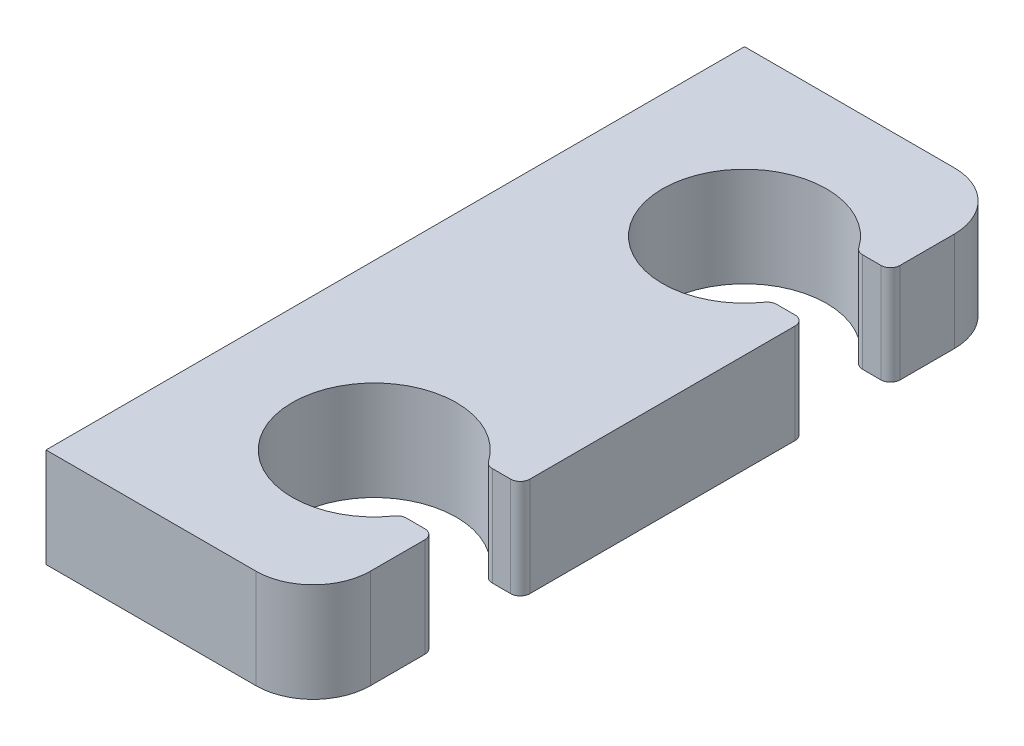
ISO-10303-21;
HEADER;
FILE_DESCRIPTION(('STEP AP214'),'2;1');
FILE_NAME('part.step','',(''),(''),'','','');
FILE_SCHEMA(('AUTOMOTIVE_DESIGN { 1 0 10303 214 1 1 1 1 }'));
ENDSEC;
DATA;
#1=APPLICATION_CONTEXT('core data for automotive mechanical design processes');
#2=APPLICATION_PROTOCOL_DEFINITION('international standard','automotive_design',2000,#1);
#3=PRODUCT_CONTEXT('',#1,'mechanical');
#4=PRODUCT('Part','Part','',(#3));
#5=PRODUCT_RELATED_PRODUCT_CATEGORY('part','',(#4));
#6=PRODUCT_DEFINITION_FORMATION('','',#4);
#7=PRODUCT_DEFINITION_CONTEXT('part definition',#1,'design');
#8=PRODUCT_DEFINITION('design','',#6,#7);
#9=PRODUCT_DEFINITION_SHAPE('','',#8);
#10=(LENGTH_UNIT() NAMED_UNIT(*) SI_UNIT(.MILLI.,.METRE.));
#11=(NAMED_UNIT(*) PLANE_ANGLE_UNIT() SI_UNIT($,.RADIAN.));
#12=(NAMED_UNIT(*) SI_UNIT($,.STERADIAN.) SOLID_ANGLE_UNIT());
#13=UNCERTAINTY_MEASURE_WITH_UNIT(LENGTH_MEASURE(1.E-05),#10,'distance_accuracy_value','');
#14=(GEOMETRIC_REPRESENTATION_CONTEXT(3) GLOBAL_UNCERTAINTY_ASSIGNED_CONTEXT((#13)) GLOBAL_UNIT_ASSIGNED_CONTEXT((#10,
#11,#12)) REPRESENTATION_CONTEXT('',''));
#15=CARTESIAN_POINT('',(0.,0.,0.));
#16=DIRECTION('',(0.,0.,1.));
#17=DIRECTION('',(1.,0.,0.));
#18=AXIS2_PLACEMENT_3D('',#15,#16,#17);
#19=CARTESIAN_POINT('',(3.5,2.6,9.15000000000001));
#20=DIRECTION('',(-1.,0.,0.));
#21=DIRECTION('',(0.,0.,1.));
#22=AXIS2_PLACEMENT_3D('',#19,#20,#21);
#23=PLANE('',#22);
#24=DIRECTION('',(0.,0.,-1.));
#25=VECTOR('',#24,1.);
#26=CARTESIAN_POINT('',(3.5,0.,9.15000000000001));
#27=LINE('',#26,#25);
#28=CARTESIAN_POINT('',(3.5,0.,-6.22500000000011));
#29=VERTEX_POINT('',#28);
#30=CARTESIAN_POINT('',(3.5,0.,-7.65));
#31=VERTEX_POINT('',#30);
#32=EDGE_CURVE('E229',#29,#31,#27,.T.);
#33=ORIENTED_EDGE('',*,*,#32,.T.);
#34=DIRECTION('',(0.,-1.,0.));
#35=VECTOR('',#34,1.);
#36=CARTESIAN_POINT('',(3.5,2.6,-7.65));
#37=LINE('',#36,#35);
#38=CARTESIAN_POINT('',(3.5,2.6,-7.65));
#39=VERTEX_POINT('',#38);
#40=EDGE_CURVE('E346',#31,#39,#37,.F.);
#41=ORIENTED_EDGE('',*,*,#40,.T.);
#42=DIRECTION('',(0.,0.,-1.));
#43=VECTOR('',#42,1.);
#44=CARTESIAN_POINT('',(3.5,2.6,9.15000000000001));
#45=LINE('',#44,#43);
#46=CARTESIAN_POINT('',(3.5,2.6,-6.22500000000011));
#47=VERTEX_POINT('',#46);
#48=EDGE_CURVE('E283',#47,#39,#45,.T.);
#49=ORIENTED_EDGE('',*,*,#48,.F.);
#50=DIRECTION('',(0.,1.,0.));
#51=VECTOR('',#50,1.);
#52=CARTESIAN_POINT('',(3.5,-7.4,-6.22500000000011));
#53=LINE('',#52,#51);
#54=EDGE_CURVE('E236',#29,#47,#53,.T.);
#55=ORIENTED_EDGE('',*,*,#54,.F.);
#56=EDGE_LOOP('',(#33,#41,#49,#55));
#57=FACE_BOUND('',#56,.T.);
#58=ADVANCED_FACE('F40',(#57),#23,.F.);
#59=CARTESIAN_POINT('',(3.5,0.,3.47499999999989));
#60=VERTEX_POINT('',#59);
#61=CARTESIAN_POINT('',(3.5,0.,-3.4750000000001));
#62=VERTEX_POINT('',#61);
#63=EDGE_CURVE('E293',#60,#62,#27,.T.);
#64=ORIENTED_EDGE('',*,*,#63,.T.);
#65=DIRECTION('',(0.,1.,0.));
#66=VECTOR('',#65,1.);
#67=CARTESIAN_POINT('',(3.5,-7.4,-3.4750000000001));
#68=LINE('',#67,#66);
#69=CARTESIAN_POINT('',(3.5,2.6,-3.4750000000001));
#70=VERTEX_POINT('',#69);
#71=EDGE_CURVE('E238',#62,#70,#68,.T.);
#72=ORIENTED_EDGE('',*,*,#71,.T.);
#73=CARTESIAN_POINT('',(3.5,2.6,3.47499999999989));
#74=VERTEX_POINT('',#73);
#75=EDGE_CURVE('E282',#74,#70,#45,.T.);
#76=ORIENTED_EDGE('',*,*,#75,.F.);
#77=DIRECTION('',(0.,1.,0.));
#78=VECTOR('',#77,1.);
#79=CARTESIAN_POINT('',(3.5,-7.4,3.47499999999989));
#80=LINE('',#79,#78);
#81=EDGE_CURVE('E275',#60,#74,#80,.T.);
#82=ORIENTED_EDGE('',*,*,#81,.F.);
#83=EDGE_LOOP('',(#64,#72,#76,#82));
#84=FACE_BOUND('',#83,.T.);
#85=ADVANCED_FACE('F395',(#84),#23,.F.);
#86=CARTESIAN_POINT('',(0.,2.6,0.));
#87=DIRECTION('',(0.,-1.,0.));
#88=DIRECTION('',(0.,0.,-1.));
#89=AXIS2_PLACEMENT_3D('',#86,#87,#88);
#90=PLANE('',#89);
#91=ORIENTED_EDGE('',*,*,#48,.T.);
#92=CARTESIAN_POINT('',(2.,2.6,-7.64999999999999));
#93=DIRECTION('',(0.,-1.,0.));
#94=DIRECTION('',(0.,0.,-1.));
#95=AXIS2_PLACEMENT_3D('',#92,#93,#94);
#96=CIRCLE('',#95,1.5);
#97=CARTESIAN_POINT('',(2.,2.6,-9.14999999999999));
#98=VERTEX_POINT('',#97);
#99=EDGE_CURVE('E349',#39,#98,#96,.F.);
#100=ORIENTED_EDGE('',*,*,#99,.T.);
#101=DIRECTION('',(-1.,0.,0.));
#102=VECTOR('',#101,1.);
#103=CARTESIAN_POINT('',(-3.5,2.6,-9.14999999999999));
#104=LINE('',#103,#102);
#105=CARTESIAN_POINT('',(-3.5,2.6,-9.14999999999999));
#106=VERTEX_POINT('',#105);
#107=EDGE_CURVE('E281',#98,#106,#104,.T.);
#108=ORIENTED_EDGE('',*,*,#107,.T.);
#109=DIRECTION('',(0.,0.,1.));
#110=VECTOR('',#109,1.);
#111=CARTESIAN_POINT('',(-3.5,2.6,9.15000000000001));
#112=LINE('',#111,#110);
#113=CARTESIAN_POINT('',(-3.5,2.6,9.15000000000001));
#114=VERTEX_POINT('',#113);
#115=EDGE_CURVE('E285',#106,#114,#112,.T.);
#116=ORIENTED_EDGE('',*,*,#115,.T.);
#117=DIRECTION('',(1.,0.,0.));
#118=VECTOR('',#117,1.);
#119=CARTESIAN_POINT('',(-3.5,2.6,9.15000000000001));
#120=LINE('',#119,#118);
#121=CARTESIAN_POINT('',(2.,2.6,9.15000000000001));
#122=VERTEX_POINT('',#121);
#123=EDGE_CURVE('E287',#114,#122,#120,.T.);
#124=ORIENTED_EDGE('',*,*,#123,.T.);
#125=CARTESIAN_POINT('',(2.,2.6,7.65000000000001));
#126=DIRECTION('',(0.,-1.,0.));
#127=DIRECTION('',(0.,0.,-1.));
#128=AXIS2_PLACEMENT_3D('',#125,#126,#127);
#129=CIRCLE('',#128,1.5);
#130=CARTESIAN_POINT('',(3.5,2.6,7.65000000000001));
#131=VERTEX_POINT('',#130);
#132=EDGE_CURVE('E55',#122,#131,#129,.F.);
#133=ORIENTED_EDGE('',*,*,#132,.T.);
#134=CARTESIAN_POINT('',(3.5,2.6,6.2249999999999));
#135=VERTEX_POINT('',#134);
#136=EDGE_CURVE('E279',#131,#135,#45,.T.);
#137=ORIENTED_EDGE('',*,*,#136,.T.);
#138=CARTESIAN_POINT('',(3.25000000000023,2.6,6.2249999999999));
#139=DIRECTION('',(0.,1.,0.));
#140=DIRECTION('',(0.,0.,1.));
#141=AXIS2_PLACEMENT_3D('',#138,#139,#140);
#142=CIRCLE('',#141,0.25);
#143=CARTESIAN_POINT('',(3.25000000000022,2.6,5.9749999999999));
#144=VERTEX_POINT('',#143);
#145=EDGE_CURVE('E242',#135,#144,#142,.T.);
#146=ORIENTED_EDGE('',*,*,#145,.T.);
#147=DIRECTION('',(1.,0.,0.));
#148=VECTOR('',#147,1.);
#149=CARTESIAN_POINT('',(0.,2.6,5.97499999999993));
#150=LINE('',#149,#148);
#151=CARTESIAN_POINT('',(2.76707269819926,2.6,5.97499999999991));
#152=VERTEX_POINT('',#151);
#153=EDGE_CURVE('E260',#152,#144,#150,.T.);
#154=ORIENTED_EDGE('',*,*,#153,.F.);
#155=CARTESIAN_POINT('',(2.76707269819926,2.6,6.22499999999991));
#156=DIRECTION('',(0.,1.,0.));
#157=DIRECTION('',(0.,0.,1.));
#158=AXIS2_PLACEMENT_3D('',#155,#156,#157);
#159=CIRCLE('',#158,0.250000000000004);
#160=CARTESIAN_POINT('',(2.56216929213685,2.6,6.08177083333324));
#161=VERTEX_POINT('',#160);
#162=EDGE_CURVE('E257',#152,#161,#159,.T.);
#163=ORIENTED_EDGE('',*,*,#162,.T.);
#164=CARTESIAN_POINT('',(0.80000000000021,2.6,4.84999999999992));
#165=DIRECTION('',(0.,1.,0.));
#166=DIRECTION('',(0.,0.,1.));
#167=AXIS2_PLACEMENT_3D('',#164,#165,#166);
#168=CIRCLE('',#167,2.15);
#169=CARTESIAN_POINT('',(2.56216929213683,2.6,3.61822916666657));
#170=VERTEX_POINT('',#169);
#171=EDGE_CURVE('E254',#170,#161,#168,.T.);
#172=ORIENTED_EDGE('',*,*,#171,.F.);
#173=CARTESIAN_POINT('',(2.76707269819922,2.6,3.47499999999991));
#174=DIRECTION('',(0.,1.,0.));
#175=DIRECTION('',(0.,0.,1.));
#176=AXIS2_PLACEMENT_3D('',#173,#174,#175);
#177=CIRCLE('',#176,0.249999999999999);
#178=CARTESIAN_POINT('',(2.76707269819923,2.6,3.72499999999991));
#179=VERTEX_POINT('',#178);
#180=EDGE_CURVE('E251',#170,#179,#177,.T.);
#181=ORIENTED_EDGE('',*,*,#180,.T.);
#182=DIRECTION('',(-1.,0.,0.));
#183=VECTOR('',#182,1.);
#184=CARTESIAN_POINT('',(0.,2.6,3.72499999999994));
#185=LINE('',#184,#183);
#186=CARTESIAN_POINT('',(3.2500000000002,2.6,3.72499999999989));
#187=VERTEX_POINT('',#186);
#188=EDGE_CURVE('E248',#187,#179,#185,.T.);
#189=ORIENTED_EDGE('',*,*,#188,.F.);
#190=CARTESIAN_POINT('',(3.25000000000019,2.6,3.47499999999989));
#191=DIRECTION('',(0.,1.,0.));
#192=DIRECTION('',(0.,0.,1.));
#193=AXIS2_PLACEMENT_3D('',#190,#191,#192);
#194=CIRCLE('',#193,0.25);
#195=EDGE_CURVE('E245',#187,#74,#194,.T.);
#196=ORIENTED_EDGE('',*,*,#195,.T.);
#197=ORIENTED_EDGE('',*,*,#75,.T.);
#198=CARTESIAN_POINT('',(3.25000000000013,2.6,-3.4750000000001));
#199=DIRECTION('',(0.,1.,0.));
#200=DIRECTION('',(0.,0.,1.));
#201=AXIS2_PLACEMENT_3D('',#198,#199,#200);
#202=CIRCLE('',#201,0.25);
#203=CARTESIAN_POINT('',(3.25000000000012,2.6,-3.7250000000001));
#204=VERTEX_POINT('',#203);
#205=EDGE_CURVE('E214',#70,#204,#202,.T.);
#206=ORIENTED_EDGE('',*,*,#205,.T.);
#207=DIRECTION('',(1.,0.,0.));
#208=VECTOR('',#207,1.);
#209=CARTESIAN_POINT('',(0.,2.6,-3.72500000000007));
#210=LINE('',#209,#208);
#211=CARTESIAN_POINT('',(2.76707269819915,2.6,-3.7250000000001));
#212=VERTEX_POINT('',#211);
#213=EDGE_CURVE('E193',#212,#204,#210,.T.);
#214=ORIENTED_EDGE('',*,*,#213,.F.);
#215=CARTESIAN_POINT('',(2.76707269819915,2.6,-3.4750000000001));
#216=DIRECTION('',(0.,1.,0.));
#217=DIRECTION('',(0.,0.,1.));
#218=AXIS2_PLACEMENT_3D('',#215,#216,#217);
#219=CIRCLE('',#218,0.250000000000001);
#220=CARTESIAN_POINT('',(2.56216929213675,2.6,-3.61822916666676));
#221=VERTEX_POINT('',#220);
#222=EDGE_CURVE('E203',#212,#221,#219,.T.);
#223=ORIENTED_EDGE('',*,*,#222,.T.);
#224=CARTESIAN_POINT('',(0.800000000000106,2.6,-4.85000000000008));
#225=DIRECTION('',(0.,1.,0.));
#226=DIRECTION('',(0.,0.,1.));
#227=AXIS2_PLACEMENT_3D('',#224,#225,#226);
#228=CIRCLE('',#227,2.15);
#229=CARTESIAN_POINT('',(2.56216929213672,2.6,-6.08177083333343));
#230=VERTEX_POINT('',#229);
#231=EDGE_CURVE('E200',#230,#221,#228,.T.);
#232=ORIENTED_EDGE('',*,*,#231,.F.);
#233=CARTESIAN_POINT('',(2.76707269819912,2.6,-6.22500000000011));
#234=DIRECTION('',(0.,1.,0.));
#235=DIRECTION('',(0.,0.,1.));
#236=AXIS2_PLACEMENT_3D('',#233,#234,#235);
#237=CIRCLE('',#236,0.250000000000001);
#238=CARTESIAN_POINT('',(2.76707269819913,2.6,-5.9750000000001));
#239=VERTEX_POINT('',#238);
#240=EDGE_CURVE('E224',#230,#239,#237,.T.);
#241=ORIENTED_EDGE('',*,*,#240,.T.);
#242=DIRECTION('',(-1.,0.,0.));
#243=VECTOR('',#242,1.);
#244=CARTESIAN_POINT('',(-1.17961196366423E-13,2.6,-5.97500000000005));
#245=LINE('',#244,#243);
#246=CARTESIAN_POINT('',(3.2500000000001,2.6,-5.97500000000011));
#247=VERTEX_POINT('',#246);
#248=EDGE_CURVE('E221',#247,#239,#245,.T.);
#249=ORIENTED_EDGE('',*,*,#248,.F.);
#250=CARTESIAN_POINT('',(3.2500000000001,2.6,-6.22500000000011));
#251=DIRECTION('',(0.,1.,0.));
#252=DIRECTION('',(0.,0.,1.));
#253=AXIS2_PLACEMENT_3D('',#250,#251,#252);
#254=CIRCLE('',#253,0.249999999999995);
#255=EDGE_CURVE('E216',#247,#47,#254,.T.);
#256=ORIENTED_EDGE('',*,*,#255,.T.);
#257=EDGE_LOOP('',(#91,#100,#108,#116,#124,#133,#137,#146,#154,#163,#172,#181,#189,#196,#197,
#206,#214,#223,#232,#241,#249,#256));
#258=FACE_BOUND('',#257,.T.);
#259=ADVANCED_FACE('F212',(#258),#90,.F.);
#260=CARTESIAN_POINT('',(0.,0.,0.));
#261=DIRECTION('',(0.,-1.,0.));
#262=DIRECTION('',(0.,0.,-1.));
#263=AXIS2_PLACEMENT_3D('',#260,#261,#262);
#264=PLANE('',#263);
#265=DIRECTION('',(-1.,0.,0.));
#266=VECTOR('',#265,1.);
#267=CARTESIAN_POINT('',(-3.5,0.,-9.14999999999999));
#268=LINE('',#267,#266);
#269=CARTESIAN_POINT('',(2.,0.,-9.14999999999999));
#270=VERTEX_POINT('',#269);
#271=CARTESIAN_POINT('',(-3.5,0.,-9.14999999999999));
#272=VERTEX_POINT('',#271);
#273=EDGE_CURVE('E292',#270,#272,#268,.T.);
#274=ORIENTED_EDGE('',*,*,#273,.F.);
#275=CARTESIAN_POINT('',(2.,0.,-7.64999999999999));
#276=DIRECTION('',(0.,-1.,0.));
#277=DIRECTION('',(0.,0.,-1.));
#278=AXIS2_PLACEMENT_3D('',#275,#276,#277);
#279=CIRCLE('',#278,1.5);
#280=EDGE_CURVE('E344',#270,#31,#279,.T.);
#281=ORIENTED_EDGE('',*,*,#280,.T.);
#282=ORIENTED_EDGE('',*,*,#32,.F.);
#283=CARTESIAN_POINT('',(3.2500000000001,0.,-6.22500000000011));
#284=DIRECTION('',(0.,-1.,0.));
#285=DIRECTION('',(0.,0.,-1.));
#286=AXIS2_PLACEMENT_3D('',#283,#284,#285);
#287=CIRCLE('',#286,0.249999999999995);
#288=CARTESIAN_POINT('',(3.2500000000001,0.,-5.97500000000011));
#289=VERTEX_POINT('',#288);
#290=EDGE_CURVE('E336',#29,#289,#287,.T.);
#291=ORIENTED_EDGE('',*,*,#290,.T.);
#292=DIRECTION('',(1.,0.,0.));
#293=VECTOR('',#292,1.);
#294=CARTESIAN_POINT('',(-1.18045407697375E-13,0.,-5.97500000000005));
#295=LINE('',#294,#293);
#296=CARTESIAN_POINT('',(2.76707269819913,0.,-5.9750000000001));
#297=VERTEX_POINT('',#296);
#298=EDGE_CURVE('E334',#297,#289,#295,.T.);
#299=ORIENTED_EDGE('',*,*,#298,.F.);
#300=CARTESIAN_POINT('',(2.76707269819912,0.,-6.22500000000011));
#301=DIRECTION('',(0.,-1.,0.));
#302=DIRECTION('',(0.,0.,-1.));
#303=AXIS2_PLACEMENT_3D('',#300,#301,#302);
#304=CIRCLE('',#303,0.250000000000001);
#305=CARTESIAN_POINT('',(2.56216929213672,0.,-6.08177083333343));
#306=VERTEX_POINT('',#305);
#307=EDGE_CURVE('E331',#297,#306,#304,.T.);
#308=ORIENTED_EDGE('',*,*,#307,.T.);
#309=CARTESIAN_POINT('',(0.800000000000106,0.,-4.85000000000008));
#310=DIRECTION('',(0.,-1.,0.));
#311=DIRECTION('',(0.,0.,-1.));
#312=AXIS2_PLACEMENT_3D('',#309,#310,#311);
#313=CIRCLE('',#312,2.15);
#314=CARTESIAN_POINT('',(2.56216929213675,0.,-3.61822916666676));
#315=VERTEX_POINT('',#314);
#316=EDGE_CURVE('E329',#315,#306,#313,.T.);
#317=ORIENTED_EDGE('',*,*,#316,.F.);
#318=CARTESIAN_POINT('',(2.76707269819915,0.,-3.4750000000001));
#319=DIRECTION('',(0.,-1.,0.));
#320=DIRECTION('',(0.,0.,-1.));
#321=AXIS2_PLACEMENT_3D('',#318,#319,#320);
#322=CIRCLE('',#321,0.250000000000001);
#323=CARTESIAN_POINT('',(2.76707269819915,0.,-3.7250000000001));
#324=VERTEX_POINT('',#323);
#325=EDGE_CURVE('E327',#315,#324,#322,.T.);
#326=ORIENTED_EDGE('',*,*,#325,.T.);
#327=DIRECTION('',(-1.,0.,0.));
#328=VECTOR('',#327,1.);
#329=CARTESIAN_POINT('',(0.,0.,-3.72500000000007));
#330=LINE('',#329,#328);
#331=CARTESIAN_POINT('',(3.25000000000012,0.,-3.7250000000001));
#332=VERTEX_POINT('',#331);
#333=EDGE_CURVE('E196',#332,#324,#330,.T.);
#334=ORIENTED_EDGE('',*,*,#333,.F.);
#335=CARTESIAN_POINT('',(3.25000000000013,0.,-3.4750000000001));
#336=DIRECTION('',(0.,-1.,0.));
#337=DIRECTION('',(0.,0.,-1.));
#338=AXIS2_PLACEMENT_3D('',#335,#336,#337);
#339=CIRCLE('',#338,0.25);
#340=EDGE_CURVE('E324',#332,#62,#339,.T.);
#341=ORIENTED_EDGE('',*,*,#340,.T.);
#342=ORIENTED_EDGE('',*,*,#63,.F.);
#343=CARTESIAN_POINT('',(3.25000000000019,0.,3.47499999999989));
#344=DIRECTION('',(0.,-1.,0.));
#345=DIRECTION('',(0.,0.,-1.));
#346=AXIS2_PLACEMENT_3D('',#343,#344,#345);
#347=CIRCLE('',#346,0.25);
#348=CARTESIAN_POINT('',(3.2500000000002,0.,3.72499999999989));
#349=VERTEX_POINT('',#348);
#350=EDGE_CURVE('E304',#60,#349,#347,.T.);
#351=ORIENTED_EDGE('',*,*,#350,.T.);
#352=DIRECTION('',(1.,0.,0.));
#353=VECTOR('',#352,1.);
#354=CARTESIAN_POINT('',(0.,0.,3.72499999999994));
#355=LINE('',#354,#353);
#356=CARTESIAN_POINT('',(2.76707269819923,0.,3.72499999999991));
#357=VERTEX_POINT('',#356);
#358=EDGE_CURVE('E307',#357,#349,#355,.T.);
#359=ORIENTED_EDGE('',*,*,#358,.F.);
#360=CARTESIAN_POINT('',(2.76707269819922,0.,3.47499999999991));
#361=DIRECTION('',(0.,-1.,0.));
#362=DIRECTION('',(0.,0.,-1.));
#363=AXIS2_PLACEMENT_3D('',#360,#361,#362);
#364=CIRCLE('',#363,0.249999999999999);
#365=CARTESIAN_POINT('',(2.56216929213683,0.,3.61822916666657));
#366=VERTEX_POINT('',#365);
#367=EDGE_CURVE('E310',#357,#366,#364,.T.);
#368=ORIENTED_EDGE('',*,*,#367,.T.);
#369=CARTESIAN_POINT('',(0.80000000000021,0.,4.84999999999992));
#370=DIRECTION('',(0.,-1.,0.));
#371=DIRECTION('',(0.,0.,-1.));
#372=AXIS2_PLACEMENT_3D('',#369,#370,#371);
#373=CIRCLE('',#372,2.15);
#374=CARTESIAN_POINT('',(2.56216929213685,0.,6.08177083333324));
#375=VERTEX_POINT('',#374);
#376=EDGE_CURVE('E313',#375,#366,#373,.T.);
#377=ORIENTED_EDGE('',*,*,#376,.F.);
#378=CARTESIAN_POINT('',(2.76707269819926,0.,6.22499999999991));
#379=DIRECTION('',(0.,-1.,0.));
#380=DIRECTION('',(0.,0.,-1.));
#381=AXIS2_PLACEMENT_3D('',#378,#379,#380);
#382=CIRCLE('',#381,0.250000000000004);
#383=CARTESIAN_POINT('',(2.76707269819926,0.,5.97499999999991));
#384=VERTEX_POINT('',#383);
#385=EDGE_CURVE('E315',#375,#384,#382,.T.);
#386=ORIENTED_EDGE('',*,*,#385,.T.);
#387=DIRECTION('',(-1.,0.,0.));
#388=VECTOR('',#387,1.);
#389=CARTESIAN_POINT('',(0.,0.,5.97499999999993));
#390=LINE('',#389,#388);
#391=CARTESIAN_POINT('',(3.25000000000022,0.,5.9749999999999));
#392=VERTEX_POINT('',#391);
#393=EDGE_CURVE('E318',#392,#384,#390,.T.);
#394=ORIENTED_EDGE('',*,*,#393,.F.);
#395=CARTESIAN_POINT('',(3.25000000000023,0.,6.2249999999999));
#396=DIRECTION('',(0.,-1.,0.));
#397=DIRECTION('',(0.,0.,-1.));
#398=AXIS2_PLACEMENT_3D('',#395,#396,#397);
#399=CIRCLE('',#398,0.25);
#400=CARTESIAN_POINT('',(3.5,0.,6.2249999999999));
#401=VERTEX_POINT('',#400);
#402=EDGE_CURVE('E320',#392,#401,#399,.T.);
#403=ORIENTED_EDGE('',*,*,#402,.T.);
#404=CARTESIAN_POINT('',(3.5,0.,7.65000000000001));
#405=VERTEX_POINT('',#404);
#406=EDGE_CURVE('E290',#405,#401,#27,.T.);
#407=ORIENTED_EDGE('',*,*,#406,.F.);
#408=CARTESIAN_POINT('',(2.,0.,7.65000000000001));
#409=DIRECTION('',(0.,-1.,0.));
#410=DIRECTION('',(0.,0.,-1.));
#411=AXIS2_PLACEMENT_3D('',#408,#409,#410);
#412=CIRCLE('',#411,1.5);
#413=CARTESIAN_POINT('',(2.,0.,9.15000000000001));
#414=VERTEX_POINT('',#413);
#415=EDGE_CURVE('E342',#405,#414,#412,.T.);
#416=ORIENTED_EDGE('',*,*,#415,.T.);
#417=DIRECTION('',(1.,0.,0.));
#418=VECTOR('',#417,1.);
#419=CARTESIAN_POINT('',(-3.5,0.,9.15000000000001));
#420=LINE('',#419,#418);
#421=CARTESIAN_POINT('',(-3.5,0.,9.15000000000001));
#422=VERTEX_POINT('',#421);
#423=EDGE_CURVE('E297',#422,#414,#420,.T.);
#424=ORIENTED_EDGE('',*,*,#423,.F.);
#425=DIRECTION('',(0.,0.,1.));
#426=VECTOR('',#425,1.);
#427=CARTESIAN_POINT('',(-3.5,0.,9.15000000000001));
#428=LINE('',#427,#426);
#429=EDGE_CURVE('E295',#272,#422,#428,.T.);
#430=ORIENTED_EDGE('',*,*,#429,.F.);
#431=EDGE_LOOP('',(#274,#281,#282,#291,#299,#308,#317,#326,#334,#341,#342,#351,#359,#368,#377,
#386,#394,#403,#407,#416,#424,#430));
#432=FACE_BOUND('',#431,.T.);
#433=ADVANCED_FACE('F359',(#432),#264,.T.);
#434=ORIENTED_EDGE('',*,*,#136,.F.);
#435=DIRECTION('',(0.,-1.,0.));
#436=VECTOR('',#435,1.);
#437=CARTESIAN_POINT('',(3.5,2.6,7.65000000000001));
#438=LINE('',#437,#436);
#439=EDGE_CURVE('E48',#131,#405,#438,.T.);
#440=ORIENTED_EDGE('',*,*,#439,.T.);
#441=ORIENTED_EDGE('',*,*,#406,.T.);
#442=DIRECTION('',(0.,1.,0.));
#443=VECTOR('',#442,1.);
#444=CARTESIAN_POINT('',(3.5,-7.4,6.2249999999999));
#445=LINE('',#444,#443);
#446=EDGE_CURVE('E263',#401,#135,#445,.T.);
#447=ORIENTED_EDGE('',*,*,#446,.T.);
#448=EDGE_LOOP('',(#434,#440,#441,#447));
#449=FACE_BOUND('',#448,.T.);
#450=ADVANCED_FACE('F354',(#449),#23,.F.);
#451=CARTESIAN_POINT('',(-3.5,2.6,-9.14999999999999));
#452=DIRECTION('',(0.,0.,1.));
#453=DIRECTION('',(1.,0.,0.));
#454=AXIS2_PLACEMENT_3D('',#451,#452,#453);
#455=PLANE('',#454);
#456=ORIENTED_EDGE('',*,*,#107,.F.);
#457=DIRECTION('',(0.,-1.,0.));
#458=VECTOR('',#457,1.);
#459=CARTESIAN_POINT('',(2.,2.6,-9.14999999999999));
#460=LINE('',#459,#458);
#461=EDGE_CURVE('E339',#98,#270,#460,.T.);
#462=ORIENTED_EDGE('',*,*,#461,.T.);
#463=ORIENTED_EDGE('',*,*,#273,.T.);
#464=DIRECTION('',(0.,-1.,0.));
#465=VECTOR('',#464,1.);
#466=CARTESIAN_POINT('',(-3.5,2.6,-9.14999999999999));
#467=LINE('',#466,#465);
#468=EDGE_CURVE('E301',#106,#272,#467,.T.);
#469=ORIENTED_EDGE('',*,*,#468,.F.);
#470=EDGE_LOOP('',(#456,#462,#463,#469));
#471=FACE_BOUND('',#470,.T.);
#472=ADVANCED_FACE('F410',(#471),#455,.F.);
#473=CARTESIAN_POINT('',(-3.5,2.6,9.15000000000001));
#474=DIRECTION('',(1.,0.,0.));
#475=DIRECTION('',(0.,0.,-1.));
#476=AXIS2_PLACEMENT_3D('',#473,#474,#475);
#477=PLANE('',#476);
#478=ORIENTED_EDGE('',*,*,#429,.T.);
#479=DIRECTION('',(0.,-1.,0.));
#480=VECTOR('',#479,1.);
#481=CARTESIAN_POINT('',(-3.5,2.6,9.15000000000001));
#482=LINE('',#481,#480);
#483=EDGE_CURVE('E289',#114,#422,#482,.T.);
#484=ORIENTED_EDGE('',*,*,#483,.F.);
#485=ORIENTED_EDGE('',*,*,#115,.F.);
#486=ORIENTED_EDGE('',*,*,#468,.T.);
#487=EDGE_LOOP('',(#478,#484,#485,#486));
#488=FACE_BOUND('',#487,.T.);
#489=ADVANCED_FACE('F415',(#488),#477,.F.);
#490=CARTESIAN_POINT('',(-3.5,2.6,9.15000000000001));
#491=DIRECTION('',(0.,0.,-1.));
#492=DIRECTION('',(-1.,0.,0.));
#493=AXIS2_PLACEMENT_3D('',#490,#491,#492);
#494=PLANE('',#493);
#495=ORIENTED_EDGE('',*,*,#423,.T.);
#496=DIRECTION('',(0.,-1.,0.));
#497=VECTOR('',#496,1.);
#498=CARTESIAN_POINT('',(2.,2.6,9.15000000000001));
#499=LINE('',#498,#497);
#500=EDGE_CURVE('E11',#414,#122,#499,.F.);
#501=ORIENTED_EDGE('',*,*,#500,.T.);
#502=ORIENTED_EDGE('',*,*,#123,.F.);
#503=ORIENTED_EDGE('',*,*,#483,.T.);
#504=EDGE_LOOP('',(#495,#501,#502,#503));
#505=FACE_BOUND('',#504,.T.);
#506=ADVANCED_FACE('F438',(#505),#494,.F.);
#507=CARTESIAN_POINT('',(3.25000000000023,-7.4,6.2249999999999));
#508=DIRECTION('',(0.,1.,0.));
#509=DIRECTION('',(0.,0.,1.));
#510=AXIS2_PLACEMENT_3D('',#507,#508,#509);
#511=CYLINDRICAL_SURFACE('',#510,0.25);
#512=DIRECTION('',(0.,1.,0.));
#513=VECTOR('',#512,1.);
#514=CARTESIAN_POINT('',(3.25000000000022,-7.4,5.9749999999999));
#515=LINE('',#514,#513);
#516=EDGE_CURVE('E209',#392,#144,#515,.T.);
#517=ORIENTED_EDGE('',*,*,#516,.T.);
#518=ORIENTED_EDGE('',*,*,#145,.F.);
#519=ORIENTED_EDGE('',*,*,#446,.F.);
#520=ORIENTED_EDGE('',*,*,#402,.F.);
#521=EDGE_LOOP('',(#517,#518,#519,#520));
#522=FACE_BOUND('',#521,.T.);
#523=ADVANCED_FACE('F364',(#522),#511,.T.);
#524=CARTESIAN_POINT('',(0.,-7.4,5.97499999999993));
#525=DIRECTION('',(0.,0.,1.));
#526=DIRECTION('',(1.,0.,0.));
#527=AXIS2_PLACEMENT_3D('',#524,#525,#526);
#528=PLANE('',#527);
#529=ORIENTED_EDGE('',*,*,#393,.T.);
#530=DIRECTION('',(0.,1.,0.));
#531=VECTOR('',#530,1.);
#532=CARTESIAN_POINT('',(2.76707269819926,-7.4,5.97499999999991));
#533=LINE('',#532,#531);
#534=EDGE_CURVE('E265',#384,#152,#533,.T.);
#535=ORIENTED_EDGE('',*,*,#534,.T.);
#536=ORIENTED_EDGE('',*,*,#153,.T.);
#537=ORIENTED_EDGE('',*,*,#516,.F.);
#538=EDGE_LOOP('',(#529,#535,#536,#537));
#539=FACE_BOUND('',#538,.T.);
#540=ADVANCED_FACE('F367',(#539),#528,.F.);
#541=CARTESIAN_POINT('',(2.76707269819926,-7.4,6.22499999999991));
#542=DIRECTION('',(0.,1.,0.));
#543=DIRECTION('',(0.,0.,1.));
#544=AXIS2_PLACEMENT_3D('',#541,#542,#543);
#545=CYLINDRICAL_SURFACE('',#544,0.250000000000004);
#546=DIRECTION('',(0.,1.,0.));
#547=VECTOR('',#546,1.);
#548=CARTESIAN_POINT('',(2.56216929213685,-7.4,6.08177083333324));
#549=LINE('',#548,#547);
#550=EDGE_CURVE('E267',#375,#161,#549,.T.);
#551=ORIENTED_EDGE('',*,*,#550,.T.);
#552=ORIENTED_EDGE('',*,*,#162,.F.);
#553=ORIENTED_EDGE('',*,*,#534,.F.);
#554=ORIENTED_EDGE('',*,*,#385,.F.);
#555=EDGE_LOOP('',(#551,#552,#553,#554));
#556=FACE_BOUND('',#555,.T.);
#557=ADVANCED_FACE('F373',(#556),#545,.T.);
#558=CARTESIAN_POINT('',(0.80000000000021,-7.4,4.84999999999992));
#559=DIRECTION('',(0.,1.,0.));
#560=DIRECTION('',(0.,0.,1.));
#561=AXIS2_PLACEMENT_3D('',#558,#559,#560);
#562=CYLINDRICAL_SURFACE('',#561,2.15);
#563=ORIENTED_EDGE('',*,*,#376,.T.);
#564=DIRECTION('',(0.,1.,0.));
#565=VECTOR('',#564,1.);
#566=CARTESIAN_POINT('',(2.56216929213683,-7.4,3.61822916666657));
#567=LINE('',#566,#565);
#568=EDGE_CURVE('E269',#366,#170,#567,.T.);
#569=ORIENTED_EDGE('',*,*,#568,.T.);
#570=ORIENTED_EDGE('',*,*,#171,.T.);
#571=ORIENTED_EDGE('',*,*,#550,.F.);
#572=EDGE_LOOP('',(#563,#569,#570,#571));
#573=FACE_BOUND('',#572,.T.);
#574=ADVANCED_FACE('F377',(#573),#562,.F.);
#575=CARTESIAN_POINT('',(2.76707269819922,-7.4,3.47499999999991));
#576=DIRECTION('',(0.,1.,0.));
#577=DIRECTION('',(0.,0.,1.));
#578=AXIS2_PLACEMENT_3D('',#575,#576,#577);
#579=CYLINDRICAL_SURFACE('',#578,0.249999999999999);
#580=DIRECTION('',(0.,1.,0.));
#581=VECTOR('',#580,1.);
#582=CARTESIAN_POINT('',(2.76707269819923,-7.4,3.72499999999991));
#583=LINE('',#582,#581);
#584=EDGE_CURVE('E271',#357,#179,#583,.T.);
#585=ORIENTED_EDGE('',*,*,#584,.T.);
#586=ORIENTED_EDGE('',*,*,#180,.F.);
#587=ORIENTED_EDGE('',*,*,#568,.F.);
#588=ORIENTED_EDGE('',*,*,#367,.F.);
#589=EDGE_LOOP('',(#585,#586,#587,#588));
#590=FACE_BOUND('',#589,.T.);
#591=ADVANCED_FACE('F381',(#590),#579,.T.);
#592=CARTESIAN_POINT('',(0.,-7.4,3.72499999999994));
#593=DIRECTION('',(0.,0.,-1.));
#594=DIRECTION('',(-1.,0.,0.));
#595=AXIS2_PLACEMENT_3D('',#592,#593,#594);
#596=PLANE('',#595);
#597=ORIENTED_EDGE('',*,*,#358,.T.);
#598=DIRECTION('',(0.,1.,0.));
#599=VECTOR('',#598,1.);
#600=CARTESIAN_POINT('',(3.2500000000002,-7.4,3.72499999999989));
#601=LINE('',#600,#599);
#602=EDGE_CURVE('E273',#349,#187,#601,.T.);
#603=ORIENTED_EDGE('',*,*,#602,.T.);
#604=ORIENTED_EDGE('',*,*,#188,.T.);
#605=ORIENTED_EDGE('',*,*,#584,.F.);
#606=EDGE_LOOP('',(#597,#603,#604,#605));
#607=FACE_BOUND('',#606,.T.);
#608=ADVANCED_FACE('F387',(#607),#596,.F.);
#609=CARTESIAN_POINT('',(3.25000000000019,-7.4,3.47499999999989));
#610=DIRECTION('',(0.,1.,0.));
#611=DIRECTION('',(0.,0.,1.));
#612=AXIS2_PLACEMENT_3D('',#609,#610,#611);
#613=CYLINDRICAL_SURFACE('',#612,0.25);
#614=ORIENTED_EDGE('',*,*,#81,.T.);
#615=ORIENTED_EDGE('',*,*,#195,.F.);
#616=ORIENTED_EDGE('',*,*,#602,.F.);
#617=ORIENTED_EDGE('',*,*,#350,.F.);
#618=EDGE_LOOP('',(#614,#615,#616,#617));
#619=FACE_BOUND('',#618,.T.);
#620=ADVANCED_FACE('F390',(#619),#613,.T.);
#621=CARTESIAN_POINT('',(2.76707269819915,-7.4,-3.4750000000001));
#622=DIRECTION('',(0.,1.,0.));
#623=DIRECTION('',(0.,0.,1.));
#624=AXIS2_PLACEMENT_3D('',#621,#622,#623);
#625=CYLINDRICAL_SURFACE('',#624,0.250000000000001);
#626=DIRECTION('',(0.,1.,0.));
#627=VECTOR('',#626,1.);
#628=CARTESIAN_POINT('',(2.56216929213675,-7.4,-3.61822916666676));
#629=LINE('',#628,#627);
#630=EDGE_CURVE('E206',#315,#221,#629,.T.);
#631=ORIENTED_EDGE('',*,*,#630,.T.);
#632=ORIENTED_EDGE('',*,*,#222,.F.);
#633=DIRECTION('',(0.,1.,0.));
#634=VECTOR('',#633,1.);
#635=CARTESIAN_POINT('',(2.76707269819915,-7.4,-3.7250000000001));
#636=LINE('',#635,#634);
#637=EDGE_CURVE('E189',#324,#212,#636,.T.);
#638=ORIENTED_EDGE('',*,*,#637,.F.);
#639=ORIENTED_EDGE('',*,*,#325,.F.);
#640=EDGE_LOOP('',(#631,#632,#638,#639));
#641=FACE_BOUND('',#640,.T.);
#642=ADVANCED_FACE('F204',(#641),#625,.T.);
#643=CARTESIAN_POINT('',(0.800000000000106,-7.4,-4.85000000000008));
#644=DIRECTION('',(0.,1.,0.));
#645=DIRECTION('',(0.,0.,1.));
#646=AXIS2_PLACEMENT_3D('',#643,#644,#645);
#647=CYLINDRICAL_SURFACE('',#646,2.15);
#648=ORIENTED_EDGE('',*,*,#316,.T.);
#649=DIRECTION('',(0.,1.,0.));
#650=VECTOR('',#649,1.);
#651=CARTESIAN_POINT('',(2.56216929213672,-7.4,-6.08177083333343));
#652=LINE('',#651,#650);
#653=EDGE_CURVE('E230',#306,#230,#652,.T.);
#654=ORIENTED_EDGE('',*,*,#653,.T.);
#655=ORIENTED_EDGE('',*,*,#231,.T.);
#656=ORIENTED_EDGE('',*,*,#630,.F.);
#657=EDGE_LOOP('',(#648,#654,#655,#656));
#658=FACE_BOUND('',#657,.T.);
#659=ADVANCED_FACE('F499',(#658),#647,.F.);
#660=CARTESIAN_POINT('',(2.76707269819912,-7.4,-6.22500000000011));
#661=DIRECTION('',(0.,1.,0.));
#662=DIRECTION('',(0.,0.,1.));
#663=AXIS2_PLACEMENT_3D('',#660,#661,#662);
#664=CYLINDRICAL_SURFACE('',#663,0.250000000000001);
#665=DIRECTION('',(0.,1.,0.));
#666=VECTOR('',#665,1.);
#667=CARTESIAN_POINT('',(2.76707269819913,-7.4,-5.9750000000001));
#668=LINE('',#667,#666);
#669=EDGE_CURVE('E232',#297,#239,#668,.T.);
#670=ORIENTED_EDGE('',*,*,#669,.T.);
#671=ORIENTED_EDGE('',*,*,#240,.F.);
#672=ORIENTED_EDGE('',*,*,#653,.F.);
#673=ORIENTED_EDGE('',*,*,#307,.F.);
#674=EDGE_LOOP('',(#670,#671,#672,#673));
#675=FACE_BOUND('',#674,.T.);
#676=ADVANCED_FACE('F506',(#675),#664,.T.);
#677=CARTESIAN_POINT('',(-1.17961196366423E-13,-7.4,-5.97500000000005));
#678=DIRECTION('',(0.,0.,-1.));
#679=DIRECTION('',(-1.,0.,0.));
#680=AXIS2_PLACEMENT_3D('',#677,#678,#679);
#681=PLANE('',#680);
#682=ORIENTED_EDGE('',*,*,#298,.T.);
#683=DIRECTION('',(0.,1.,0.));
#684=VECTOR('',#683,1.);
#685=CARTESIAN_POINT('',(3.2500000000001,-7.4,-5.97500000000011));
#686=LINE('',#685,#684);
#687=EDGE_CURVE('E234',#289,#247,#686,.T.);
#688=ORIENTED_EDGE('',*,*,#687,.T.);
#689=ORIENTED_EDGE('',*,*,#248,.T.);
#690=ORIENTED_EDGE('',*,*,#669,.F.);
#691=EDGE_LOOP('',(#682,#688,#689,#690));
#692=FACE_BOUND('',#691,.T.);
#693=ADVANCED_FACE('F514',(#692),#681,.F.);
#694=CARTESIAN_POINT('',(3.2500000000001,-7.4,-6.22500000000011));
#695=DIRECTION('',(0.,1.,0.));
#696=DIRECTION('',(0.,0.,1.));
#697=AXIS2_PLACEMENT_3D('',#694,#695,#696);
#698=CYLINDRICAL_SURFACE('',#697,0.249999999999995);
#699=ORIENTED_EDGE('',*,*,#54,.T.);
#700=ORIENTED_EDGE('',*,*,#255,.F.);
#701=ORIENTED_EDGE('',*,*,#687,.F.);
#702=ORIENTED_EDGE('',*,*,#290,.F.);
#703=EDGE_LOOP('',(#699,#700,#701,#702));
#704=FACE_BOUND('',#703,.T.);
#705=ADVANCED_FACE('F522',(#704),#698,.T.);
#706=CARTESIAN_POINT('',(3.25000000000013,-7.4,-3.4750000000001));
#707=DIRECTION('',(0.,1.,0.));
#708=DIRECTION('',(0.,0.,1.));
#709=AXIS2_PLACEMENT_3D('',#706,#707,#708);
#710=CYLINDRICAL_SURFACE('',#709,0.25);
#711=DIRECTION('',(0.,1.,0.));
#712=VECTOR('',#711,1.);
#713=CARTESIAN_POINT('',(3.25000000000012,-7.4,-3.7250000000001));
#714=LINE('',#713,#712);
#715=EDGE_CURVE('E199',#332,#204,#714,.T.);
#716=ORIENTED_EDGE('',*,*,#715,.T.);
#717=ORIENTED_EDGE('',*,*,#205,.F.);
#718=ORIENTED_EDGE('',*,*,#71,.F.);
#719=ORIENTED_EDGE('',*,*,#340,.F.);
#720=EDGE_LOOP('',(#716,#717,#718,#719));
#721=FACE_BOUND('',#720,.T.);
#722=ADVANCED_FACE('F530',(#721),#710,.T.);
#723=CARTESIAN_POINT('',(0.,-7.4,-3.72500000000007));
#724=DIRECTION('',(0.,0.,1.));
#725=DIRECTION('',(1.,0.,0.));
#726=AXIS2_PLACEMENT_3D('',#723,#724,#725);
#727=PLANE('',#726);
#728=ORIENTED_EDGE('',*,*,#333,.T.);
#729=ORIENTED_EDGE('',*,*,#637,.T.);
#730=ORIENTED_EDGE('',*,*,#213,.T.);
#731=ORIENTED_EDGE('',*,*,#715,.F.);
#732=EDGE_LOOP('',(#728,#729,#730,#731));
#733=FACE_BOUND('',#732,.T.);
#734=ADVANCED_FACE('F191',(#733),#727,.F.);
#735=CARTESIAN_POINT('',(2.,2.6,-7.64999999999999));
#736=DIRECTION('',(0.,-1.,0.));
#737=DIRECTION('',(0.,0.,-1.));
#738=AXIS2_PLACEMENT_3D('',#735,#736,#737);
#739=CYLINDRICAL_SURFACE('',#738,1.5);
#740=ORIENTED_EDGE('',*,*,#99,.F.);
#741=ORIENTED_EDGE('',*,*,#40,.F.);
#742=ORIENTED_EDGE('',*,*,#280,.F.);
#743=ORIENTED_EDGE('',*,*,#461,.F.);
#744=EDGE_LOOP('',(#740,#741,#742,#743));
#745=FACE_BOUND('',#744,.T.);
#746=ADVANCED_FACE('F405',(#745),#739,.T.);
#747=CARTESIAN_POINT('',(2.,2.6,7.65000000000001));
#748=DIRECTION('',(0.,-1.,0.));
#749=DIRECTION('',(0.,0.,-1.));
#750=AXIS2_PLACEMENT_3D('',#747,#748,#749);
#751=CYLINDRICAL_SURFACE('',#750,1.5);
#752=ORIENTED_EDGE('',*,*,#132,.F.);
#753=ORIENTED_EDGE('',*,*,#500,.F.);
#754=ORIENTED_EDGE('',*,*,#415,.F.);
#755=ORIENTED_EDGE('',*,*,#439,.F.);
#756=EDGE_LOOP('',(#752,#753,#754,#755));
#757=FACE_BOUND('',#756,.T.);
#758=ADVANCED_FACE('F42',(#757),#751,.T.);
#759=CLOSED_SHELL('',(#58,#85,#259,#433,#450,#472,#489,#506,#523,#540,#557,#574,#591,#608,#620,
#642,#659,#676,#693,#705,#722,#734,#746,#758));
#760=MANIFOLD_SOLID_BREP('B2',#759);
#761=ADVANCED_BREP_SHAPE_REPRESENTATION('',(#18,#760),#14);
#762=SHAPE_DEFINITION_REPRESENTATION(#9,#761);
ENDSEC;
END-ISO-10303-21;
